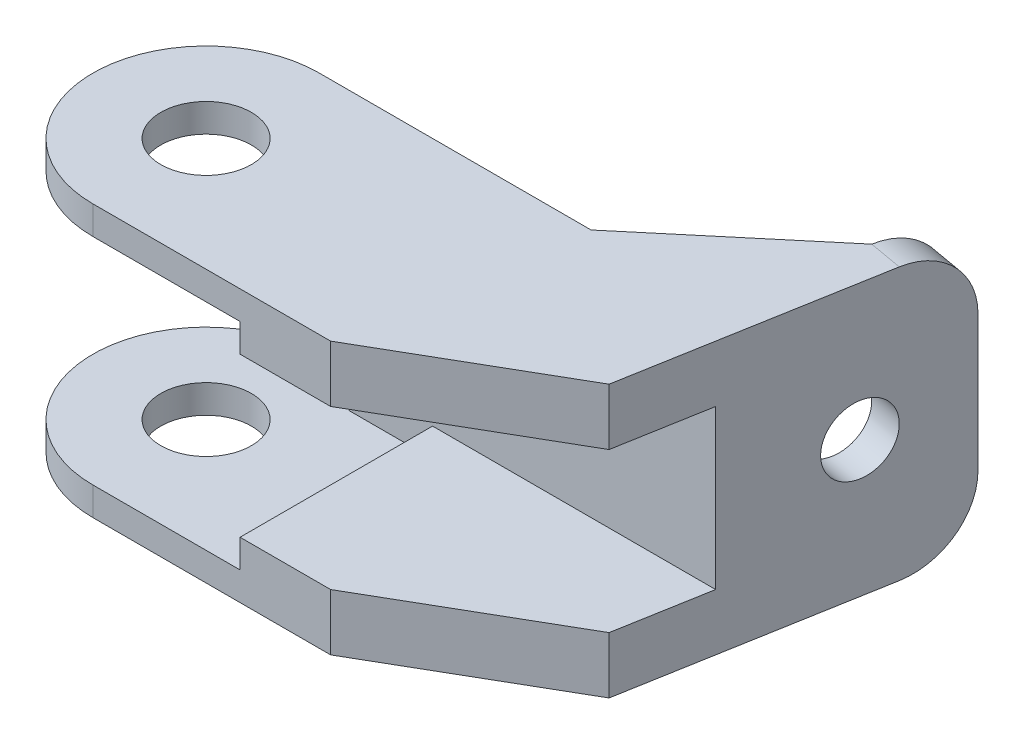
ISO-10303-21;
HEADER;
FILE_DESCRIPTION(('STEP AP214'),'2;1');
FILE_NAME('part.step','',(''),(''),'','','');
FILE_SCHEMA(('AUTOMOTIVE_DESIGN { 1 0 10303 214 1 1 1 1 }'));
ENDSEC;
DATA;
#1=APPLICATION_CONTEXT('core data for automotive mechanical design processes');
#2=APPLICATION_PROTOCOL_DEFINITION('international standard','automotive_design',2000,#1);
#3=PRODUCT_CONTEXT('',#1,'mechanical');
#4=PRODUCT('Part','Part','',(#3));
#5=PRODUCT_RELATED_PRODUCT_CATEGORY('part','',(#4));
#6=PRODUCT_DEFINITION_FORMATION('','',#4);
#7=PRODUCT_DEFINITION_CONTEXT('part definition',#1,'design');
#8=PRODUCT_DEFINITION('design','',#6,#7);
#9=PRODUCT_DEFINITION_SHAPE('','',#8);
#10=(LENGTH_UNIT() NAMED_UNIT(*) SI_UNIT(.MILLI.,.METRE.));
#11=(NAMED_UNIT(*) PLANE_ANGLE_UNIT() SI_UNIT($,.RADIAN.));
#12=(NAMED_UNIT(*) SI_UNIT($,.STERADIAN.) SOLID_ANGLE_UNIT());
#13=UNCERTAINTY_MEASURE_WITH_UNIT(LENGTH_MEASURE(1.E-05),#10,'distance_accuracy_value','');
#14=(GEOMETRIC_REPRESENTATION_CONTEXT(3) GLOBAL_UNCERTAINTY_ASSIGNED_CONTEXT((#13)) GLOBAL_UNIT_ASSIGNED_CONTEXT((#10,
#11,#12)) REPRESENTATION_CONTEXT('',''));
#15=CARTESIAN_POINT('',(0.,0.,0.));
#16=DIRECTION('',(0.,0.,1.));
#17=DIRECTION('',(1.,0.,0.));
#18=AXIS2_PLACEMENT_3D('',#15,#16,#17);
#19=CARTESIAN_POINT('',(-99.25,8.25,30.));
#20=DIRECTION('',(0.,-1.,0.));
#21=DIRECTION('',(0.,0.,-1.));
#22=AXIS2_PLACEMENT_3D('',#19,#20,#21);
#23=PLANE('',#22);
#24=CARTESIAN_POINT('',(-100.,8.25,30.));
#25=DIRECTION('',(0.,1.,0.));
#26=DIRECTION('',(0.,0.,1.));
#27=AXIS2_PLACEMENT_3D('',#24,#25,#26);
#28=CIRCLE('',#27,2.);
#29=CARTESIAN_POINT('',(-100.,8.25,32.));
#30=VERTEX_POINT('',#29);
#31=EDGE_CURVE('E289',#30,#30,#28,.T.);
#32=ORIENTED_EDGE('',*,*,#31,.T.);
#33=EDGE_LOOP('',(#32));
#34=FACE_BOUND('',#33,.T.);
#35=DIRECTION('',(0.,0.,1.));
#36=VECTOR('',#35,1.);
#37=CARTESIAN_POINT('',(-97.2,8.25,22.469683814224));
#38=LINE('',#37,#36);
#39=CARTESIAN_POINT('',(-97.2,8.25,25.));
#40=VERTEX_POINT('',#39);
#41=CARTESIAN_POINT('',(-97.2,8.25,26.5));
#42=VERTEX_POINT('',#41);
#43=EDGE_CURVE('E226',#40,#42,#38,.T.);
#44=ORIENTED_EDGE('',*,*,#43,.T.);
#45=DIRECTION('',(1.,0.,0.));
#46=VECTOR('',#45,1.);
#47=CARTESIAN_POINT('',(-99.25,8.25,26.5));
#48=LINE('',#47,#46);
#49=CARTESIAN_POINT('',(-93.5,8.25,26.5));
#50=VERTEX_POINT('',#49);
#51=EDGE_CURVE('E299',#42,#50,#48,.T.);
#52=ORIENTED_EDGE('',*,*,#51,.T.);
#53=DIRECTION('',(0.,0.,-1.));
#54=VECTOR('',#53,1.);
#55=CARTESIAN_POINT('',(-93.5,8.25,30.));
#56=LINE('',#55,#54);
#57=CARTESIAN_POINT('',(-93.5,8.25,35.));
#58=VERTEX_POINT('',#57);
#59=EDGE_CURVE('E302',#50,#58,#56,.F.);
#60=ORIENTED_EDGE('',*,*,#59,.T.);
#61=DIRECTION('',(1.,0.,0.));
#62=VECTOR('',#61,1.);
#63=CARTESIAN_POINT('',(-94.75,8.25,35.));
#64=LINE('',#63,#62);
#65=CARTESIAN_POINT('',(-100.,8.25,35.));
#66=VERTEX_POINT('',#65);
#67=EDGE_CURVE('E253',#66,#58,#64,.T.);
#68=ORIENTED_EDGE('',*,*,#67,.F.);
#69=CARTESIAN_POINT('',(-100.,8.25,30.));
#70=DIRECTION('',(0.,1.,0.));
#71=DIRECTION('',(0.,0.,1.));
#72=AXIS2_PLACEMENT_3D('',#69,#70,#71);
#73=CIRCLE('',#72,5.);
#74=CARTESIAN_POINT('',(-100.,8.25,25.));
#75=VERTEX_POINT('',#74);
#76=EDGE_CURVE('E249',#75,#66,#73,.T.);
#77=ORIENTED_EDGE('',*,*,#76,.F.);
#78=DIRECTION('',(-1.,0.,0.));
#79=VECTOR('',#78,1.);
#80=CARTESIAN_POINT('',(-90.5,8.25,25.));
#81=LINE('',#80,#79);
#82=EDGE_CURVE('E245',#40,#75,#81,.T.);
#83=ORIENTED_EDGE('',*,*,#82,.F.);
#84=EDGE_LOOP('',(#44,#52,#60,#68,#77,#83));
#85=FACE_BOUND('',#84,.T.);
#86=ADVANCED_FACE('F34',(#34,#85),#23,.T.);
#87=CARTESIAN_POINT('',(-93.5,3.5,30.));
#88=DIRECTION('',(-1.,0.,0.));
#89=DIRECTION('',(0.,0.,1.));
#90=AXIS2_PLACEMENT_3D('',#87,#88,#89);
#91=PLANE('',#90);
#92=DIRECTION('',(0.,1.,0.));
#93=VECTOR('',#92,1.);
#94=CARTESIAN_POINT('',(-93.5,-2.5,35.));
#95=LINE('',#94,#93);
#96=CARTESIAN_POINT('',(-93.5,0.,35.));
#97=VERTEX_POINT('',#96);
#98=CARTESIAN_POINT('',(-93.5,-1.25,35.));
#99=VERTEX_POINT('',#98);
#100=EDGE_CURVE('E229',#97,#99,#95,.F.);
#101=ORIENTED_EDGE('',*,*,#100,.F.);
#102=DIRECTION('',(0.,0.,-1.));
#103=VECTOR('',#102,1.);
#104=CARTESIAN_POINT('',(-93.5,0.,30.));
#105=LINE('',#104,#103);
#106=CARTESIAN_POINT('',(-93.5,0.,26.5));
#107=VERTEX_POINT('',#106);
#108=EDGE_CURVE('E282',#97,#107,#105,.T.);
#109=ORIENTED_EDGE('',*,*,#108,.T.);
#110=DIRECTION('',(0.,1.,0.));
#111=VECTOR('',#110,1.);
#112=CARTESIAN_POINT('',(-93.5,-1.25,26.5));
#113=LINE('',#112,#111);
#114=CARTESIAN_POINT('',(-93.5,-1.25,26.5));
#115=VERTEX_POINT('',#114);
#116=EDGE_CURVE('E308',#115,#107,#113,.T.);
#117=ORIENTED_EDGE('',*,*,#116,.F.);
#118=DIRECTION('',(0.,0.,-1.));
#119=VECTOR('',#118,1.);
#120=CARTESIAN_POINT('',(-93.5,-1.25,30.));
#121=LINE('',#120,#119);
#122=EDGE_CURVE('E324',#115,#99,#121,.F.);
#123=ORIENTED_EDGE('',*,*,#122,.T.);
#124=EDGE_LOOP('',(#101,#109,#117,#123));
#125=FACE_BOUND('',#124,.T.);
#126=ADVANCED_FACE('F496',(#125),#91,.T.);
#127=CARTESIAN_POINT('',(-94.75,-2.5,35.));
#128=DIRECTION('',(0.,0.,1.));
#129=DIRECTION('',(1.,0.,0.));
#130=AXIS2_PLACEMENT_3D('',#127,#128,#129);
#131=PLANE('',#130);
#132=DIRECTION('',(1.,0.,0.));
#133=VECTOR('',#132,1.);
#134=CARTESIAN_POINT('',(-92.8126047629245,-2.5,35.));
#135=LINE('',#134,#133);
#136=CARTESIAN_POINT('',(-89.5,-2.5,35.));
#137=VERTEX_POINT('',#136);
#138=CARTESIAN_POINT('',(-100.,-2.5,35.));
#139=VERTEX_POINT('',#138);
#140=EDGE_CURVE('E268',#137,#139,#135,.F.);
#141=ORIENTED_EDGE('',*,*,#140,.F.);
#142=DIRECTION('',(0.,1.,0.));
#143=VECTOR('',#142,1.);
#144=CARTESIAN_POINT('',(-89.5,-2.5,35.));
#145=LINE('',#144,#143);
#146=CARTESIAN_POINT('',(-89.5,0.,35.));
#147=VERTEX_POINT('',#146);
#148=EDGE_CURVE('E296',#147,#137,#145,.F.);
#149=ORIENTED_EDGE('',*,*,#148,.F.);
#150=DIRECTION('',(1.,0.,0.));
#151=VECTOR('',#150,1.);
#152=CARTESIAN_POINT('',(-91.,0.,35.));
#153=LINE('',#152,#151);
#154=EDGE_CURVE('E314',#147,#97,#153,.F.);
#155=ORIENTED_EDGE('',*,*,#154,.T.);
#156=ORIENTED_EDGE('',*,*,#100,.T.);
#157=DIRECTION('',(1.,0.,0.));
#158=VECTOR('',#157,1.);
#159=CARTESIAN_POINT('',(-99.25,-1.25,35.));
#160=LINE('',#159,#158);
#161=CARTESIAN_POINT('',(-100.,-1.25,35.));
#162=VERTEX_POINT('',#161);
#163=EDGE_CURVE('E336',#99,#162,#160,.F.);
#164=ORIENTED_EDGE('',*,*,#163,.T.);
#165=DIRECTION('',(0.,1.,0.));
#166=VECTOR('',#165,1.);
#167=CARTESIAN_POINT('',(-100.,-2.5,35.));
#168=LINE('',#167,#166);
#169=EDGE_CURVE('E309',#139,#162,#168,.T.);
#170=ORIENTED_EDGE('',*,*,#169,.F.);
#171=EDGE_LOOP('',(#141,#149,#155,#156,#164,#170));
#172=FACE_BOUND('',#171,.T.);
#173=ADVANCED_FACE('F504',(#172),#131,.T.);
#174=CARTESIAN_POINT('',(-100.,-2.5,30.));
#175=DIRECTION('',(0.,1.,0.));
#176=DIRECTION('',(0.,0.,1.));
#177=AXIS2_PLACEMENT_3D('',#174,#175,#176);
#178=CYLINDRICAL_SURFACE('',#177,5.);
#179=CARTESIAN_POINT('',(-100.,-2.5,30.));
#180=DIRECTION('',(0.,1.,0.));
#181=DIRECTION('',(0.,0.,1.));
#182=AXIS2_PLACEMENT_3D('',#179,#180,#181);
#183=CIRCLE('',#182,5.);
#184=CARTESIAN_POINT('',(-100.,-2.5,25.));
#185=VERTEX_POINT('',#184);
#186=EDGE_CURVE('E269',#139,#185,#183,.F.);
#187=ORIENTED_EDGE('',*,*,#186,.F.);
#188=ORIENTED_EDGE('',*,*,#169,.T.);
#189=CARTESIAN_POINT('',(-100.,-1.25,30.));
#190=DIRECTION('',(0.,1.,0.));
#191=DIRECTION('',(0.,0.,1.));
#192=AXIS2_PLACEMENT_3D('',#189,#190,#191);
#193=CIRCLE('',#192,5.);
#194=CARTESIAN_POINT('',(-100.,-1.25,25.));
#195=VERTEX_POINT('',#194);
#196=EDGE_CURVE('E363',#162,#195,#193,.F.);
#197=ORIENTED_EDGE('',*,*,#196,.T.);
#198=DIRECTION('',(0.,1.,0.));
#199=VECTOR('',#198,1.);
#200=CARTESIAN_POINT('',(-100.,-2.5,25.));
#201=LINE('',#200,#199);
#202=EDGE_CURVE('E328',#195,#185,#201,.F.);
#203=ORIENTED_EDGE('',*,*,#202,.T.);
#204=EDGE_LOOP('',(#187,#188,#197,#203));
#205=FACE_BOUND('',#204,.T.);
#206=ADVANCED_FACE('F565',(#205),#178,.T.);
#207=CARTESIAN_POINT('',(-100.,3.5,30.));
#208=DIRECTION('',(0.,1.,0.));
#209=DIRECTION('',(0.,0.,1.));
#210=AXIS2_PLACEMENT_3D('',#207,#208,#209);
#211=CYLINDRICAL_SURFACE('',#210,2.);
#212=CARTESIAN_POINT('',(-100.,-1.25,30.));
#213=DIRECTION('',(0.,1.,0.));
#214=DIRECTION('',(0.,0.,1.));
#215=AXIS2_PLACEMENT_3D('',#212,#213,#214);
#216=CIRCLE('',#215,2.);
#217=CARTESIAN_POINT('',(-100.,-1.25,32.));
#218=VERTEX_POINT('',#217);
#219=EDGE_CURVE('E318',#218,#218,#216,.T.);
#220=ORIENTED_EDGE('',*,*,#219,.T.);
#221=EDGE_LOOP('',(#220));
#222=FACE_BOUND('',#221,.T.);
#223=CARTESIAN_POINT('',(-100.,-2.5,30.));
#224=DIRECTION('',(0.,1.,0.));
#225=DIRECTION('',(0.,0.,1.));
#226=AXIS2_PLACEMENT_3D('',#223,#224,#225);
#227=CIRCLE('',#226,2.);
#228=CARTESIAN_POINT('',(-100.,-2.5,32.));
#229=VERTEX_POINT('',#228);
#230=EDGE_CURVE('E367',#229,#229,#227,.T.);
#231=ORIENTED_EDGE('',*,*,#230,.F.);
#232=EDGE_LOOP('',(#231));
#233=FACE_BOUND('',#232,.T.);
#234=ADVANCED_FACE('F561',(#222,#233),#211,.F.);
#235=CARTESIAN_POINT('',(-93.5,3.5,30.));
#236=DIRECTION('',(-1.,0.,0.));
#237=DIRECTION('',(0.,0.,1.));
#238=AXIS2_PLACEMENT_3D('',#235,#236,#237);
#239=PLANE('',#238);
#240=DIRECTION('',(0.,1.,0.));
#241=VECTOR('',#240,1.);
#242=CARTESIAN_POINT('',(-93.5,3.5,35.));
#243=LINE('',#242,#241);
#244=CARTESIAN_POINT('',(-93.5,7.,35.));
#245=VERTEX_POINT('',#244);
#246=EDGE_CURVE('E306',#245,#58,#243,.T.);
#247=ORIENTED_EDGE('',*,*,#246,.T.);
#248=ORIENTED_EDGE('',*,*,#59,.F.);
#249=DIRECTION('',(0.,1.,0.));
#250=VECTOR('',#249,1.);
#251=CARTESIAN_POINT('',(-93.5,-1.25,26.5));
#252=LINE('',#251,#250);
#253=CARTESIAN_POINT('',(-93.5,7.,26.5));
#254=VERTEX_POINT('',#253);
#255=EDGE_CURVE('E312',#254,#50,#252,.T.);
#256=ORIENTED_EDGE('',*,*,#255,.F.);
#257=DIRECTION('',(0.,0.,-1.));
#258=VECTOR('',#257,1.);
#259=CARTESIAN_POINT('',(-93.5,7.,30.));
#260=LINE('',#259,#258);
#261=EDGE_CURVE('E295',#245,#254,#260,.T.);
#262=ORIENTED_EDGE('',*,*,#261,.F.);
#263=EDGE_LOOP('',(#247,#248,#256,#262));
#264=FACE_BOUND('',#263,.T.);
#265=ADVANCED_FACE('F557',(#264),#239,.T.);
#266=CARTESIAN_POINT('',(-89.1,-1.25,26.5));
#267=DIRECTION('',(0.,0.,1.));
#268=DIRECTION('',(1.,0.,0.));
#269=AXIS2_PLACEMENT_3D('',#266,#267,#268);
#270=PLANE('',#269);
#271=ORIENTED_EDGE('',*,*,#51,.F.);
#272=DIRECTION('',(0.,1.,0.));
#273=VECTOR('',#272,1.);
#274=CARTESIAN_POINT('',(-97.2,-1.25,26.5));
#275=LINE('',#274,#273);
#276=CARTESIAN_POINT('',(-97.2,-1.25,26.5));
#277=VERTEX_POINT('',#276);
#278=EDGE_CURVE('E303',#277,#42,#275,.T.);
#279=ORIENTED_EDGE('',*,*,#278,.F.);
#280=DIRECTION('',(1.,0.,0.));
#281=VECTOR('',#280,1.);
#282=CARTESIAN_POINT('',(-99.25,-1.25,26.5));
#283=LINE('',#282,#281);
#284=EDGE_CURVE('E321',#277,#115,#283,.T.);
#285=ORIENTED_EDGE('',*,*,#284,.T.);
#286=ORIENTED_EDGE('',*,*,#116,.T.);
#287=DIRECTION('',(1.,0.,0.));
#288=VECTOR('',#287,1.);
#289=CARTESIAN_POINT('',(-91.,0.,26.5));
#290=LINE('',#289,#288);
#291=CARTESIAN_POINT('',(-81.,0.,26.5));
#292=VERTEX_POINT('',#291);
#293=EDGE_CURVE('E279',#107,#292,#290,.T.);
#294=ORIENTED_EDGE('',*,*,#293,.T.);
#295=DIRECTION('',(0.,1.,0.));
#296=VECTOR('',#295,1.);
#297=CARTESIAN_POINT('',(-81.,-2.5,26.5));
#298=LINE('',#297,#296);
#299=CARTESIAN_POINT('',(-81.,7.,26.4999999999999));
#300=VERTEX_POINT('',#299);
#301=EDGE_CURVE('E285',#300,#292,#298,.F.);
#302=ORIENTED_EDGE('',*,*,#301,.F.);
#303=DIRECTION('',(1.,0.,0.));
#304=VECTOR('',#303,1.);
#305=CARTESIAN_POINT('',(-91.,7.,26.5));
#306=LINE('',#305,#304);
#307=EDGE_CURVE('E292',#254,#300,#306,.T.);
#308=ORIENTED_EDGE('',*,*,#307,.F.);
#309=ORIENTED_EDGE('',*,*,#255,.T.);
#310=EDGE_LOOP('',(#271,#279,#285,#286,#294,#302,#308,#309));
#311=FACE_BOUND('',#310,.T.);
#312=ADVANCED_FACE('F553',(#311),#270,.T.);
#313=CARTESIAN_POINT('',(-91.,0.,30.));
#314=DIRECTION('',(0.,-1.,0.));
#315=DIRECTION('',(0.,0.,-1.));
#316=AXIS2_PLACEMENT_3D('',#313,#314,#315);
#317=PLANE('',#316);
#318=DIRECTION('',(0.86602540378496,0.,-0.499999999999097));
#319=VECTOR('',#318,1.);
#320=CARTESIAN_POINT('',(-85.25,0.,32.54626135595));
#321=LINE('',#320,#319);
#322=CARTESIAN_POINT('',(-81.7052553958245,0.,30.4997021045267));
#323=VERTEX_POINT('',#322);
#324=EDGE_CURVE('E270',#323,#147,#321,.F.);
#325=ORIENTED_EDGE('',*,*,#324,.F.);
#326=DIRECTION('',(0.173648177666935,0.,-0.984807753012207));
#327=VECTOR('',#326,1.);
#328=CARTESIAN_POINT('',(-81.9000721468904,0.,31.6045628030037));
#329=LINE('',#328,#327);
#330=EDGE_CURVE('E462',#323,#292,#329,.T.);
#331=ORIENTED_EDGE('',*,*,#330,.T.);
#332=ORIENTED_EDGE('',*,*,#293,.F.);
#333=ORIENTED_EDGE('',*,*,#108,.F.);
#334=ORIENTED_EDGE('',*,*,#154,.F.);
#335=EDGE_LOOP('',(#325,#331,#332,#333,#334));
#336=FACE_BOUND('',#335,.T.);
#337=ADVANCED_FACE('F549',(#336),#317,.F.);
#338=CARTESIAN_POINT('',(-85.25,-2.5,32.54626135595));
#339=DIRECTION('',(0.499999999999097,0.,0.86602540378496));
#340=DIRECTION('',(0.86602540378496,0.,-0.499999999999097));
#341=AXIS2_PLACEMENT_3D('',#338,#339,#340);
#342=PLANE('',#341);
#343=DIRECTION('',(0.,1.,0.));
#344=VECTOR('',#343,1.);
#345=CARTESIAN_POINT('',(-81.7052553958245,-2.50010307764071,30.4997021045267));
#346=LINE('',#345,#344);
#347=CARTESIAN_POINT('',(-81.7052553958245,-2.5,30.4997021045267));
#348=VERTEX_POINT('',#347);
#349=EDGE_CURVE('E464',#348,#323,#346,.T.);
#350=ORIENTED_EDGE('',*,*,#349,.T.);
#351=ORIENTED_EDGE('',*,*,#324,.T.);
#352=ORIENTED_EDGE('',*,*,#148,.T.);
#353=DIRECTION('',(-0.86602540378496,0.,0.499999999999097));
#354=VECTOR('',#353,1.);
#355=CARTESIAN_POINT('',(-81.,-2.5,30.0925227119));
#356=LINE('',#355,#354);
#357=EDGE_CURVE('E265',#348,#137,#356,.T.);
#358=ORIENTED_EDGE('',*,*,#357,.F.);
#359=EDGE_LOOP('',(#350,#351,#352,#358));
#360=FACE_BOUND('',#359,.T.);
#361=ADVANCED_FACE('F546',(#360),#342,.T.);
#362=CARTESIAN_POINT('',(-91.,7.,30.));
#363=DIRECTION('',(0.,-1.,0.));
#364=DIRECTION('',(0.,0.,-1.));
#365=AXIS2_PLACEMENT_3D('',#362,#363,#364);
#366=PLANE('',#365);
#367=DIRECTION('',(0.173648177666935,0.,-0.984807753012207));
#368=VECTOR('',#367,1.);
#369=CARTESIAN_POINT('',(-81.9000721468904,7.,31.6045628030037));
#370=LINE('',#369,#368);
#371=CARTESIAN_POINT('',(-81.7052553958245,7.,30.4997021045267));
#372=VERTEX_POINT('',#371);
#373=EDGE_CURVE('E460',#372,#300,#370,.T.);
#374=ORIENTED_EDGE('',*,*,#373,.F.);
#375=DIRECTION('',(0.86602540378496,0.,-0.499999999999097));
#376=VECTOR('',#375,1.);
#377=CARTESIAN_POINT('',(-85.25,7.,32.54626135595));
#378=LINE('',#377,#376);
#379=CARTESIAN_POINT('',(-89.5,7.,35.));
#380=VERTEX_POINT('',#379);
#381=EDGE_CURVE('E288',#380,#372,#378,.T.);
#382=ORIENTED_EDGE('',*,*,#381,.F.);
#383=DIRECTION('',(1.,0.,0.));
#384=VECTOR('',#383,1.);
#385=CARTESIAN_POINT('',(-94.75,7.,35.));
#386=LINE('',#385,#384);
#387=EDGE_CURVE('E254',#245,#380,#386,.T.);
#388=ORIENTED_EDGE('',*,*,#387,.F.);
#389=ORIENTED_EDGE('',*,*,#261,.T.);
#390=ORIENTED_EDGE('',*,*,#307,.T.);
#391=EDGE_LOOP('',(#374,#382,#388,#389,#390));
#392=FACE_BOUND('',#391,.T.);
#393=ADVANCED_FACE('F459',(#392),#366,.T.);
#394=CARTESIAN_POINT('',(-92.8126047629245,-2.5,29.500888957171));
#395=DIRECTION('',(0.,-1.,0.));
#396=DIRECTION('',(0.,0.,-1.));
#397=AXIS2_PLACEMENT_3D('',#394,#395,#396);
#398=PLANE('',#397);
#399=DIRECTION('',(0.766044443118981,0.,-0.642787609686536));
#400=VECTOR('',#399,1.);
#401=CARTESIAN_POINT('',(-88.,-2.5,25.));
#402=LINE('',#401,#400);
#403=CARTESIAN_POINT('',(-88.,-2.5,25.));
#404=VERTEX_POINT('',#403);
#405=CARTESIAN_POINT('',(-81.2616743858498,-2.5,19.3458734624141));
#406=VERTEX_POINT('',#405);
#407=EDGE_CURVE('E419',#404,#406,#402,.T.);
#408=ORIENTED_EDGE('',*,*,#407,.T.);
#409=DIRECTION('',(0.984807753012207,0.,0.173648177666938));
#410=VECTOR('',#409,1.);
#411=CARTESIAN_POINT('',(-90.7276916661659,-2.5,17.6767592160418));
#412=LINE('',#411,#410);
#413=CARTESIAN_POINT('',(-79.7844627563315,-2.5,19.6063457289146));
#414=VERTEX_POINT('',#413);
#415=EDGE_CURVE('E232',#406,#414,#412,.T.);
#416=ORIENTED_EDGE('',*,*,#415,.T.);
#417=DIRECTION('',(-0.173648177666935,0.,0.984807753012207));
#418=VECTOR('',#417,1.);
#419=CARTESIAN_POINT('',(-81.,-2.5,26.5));
#420=LINE('',#419,#418);
#421=EDGE_CURVE('E217',#414,#348,#420,.T.);
#422=ORIENTED_EDGE('',*,*,#421,.T.);
#423=ORIENTED_EDGE('',*,*,#357,.T.);
#424=ORIENTED_EDGE('',*,*,#140,.T.);
#425=ORIENTED_EDGE('',*,*,#186,.T.);
#426=DIRECTION('',(-1.,0.,0.));
#427=VECTOR('',#426,1.);
#428=CARTESIAN_POINT('',(-90.5,-2.5,25.));
#429=LINE('',#428,#427);
#430=EDGE_CURVE('E248',#404,#185,#429,.T.);
#431=ORIENTED_EDGE('',*,*,#430,.F.);
#432=EDGE_LOOP('',(#408,#416,#422,#423,#424,#425,#431));
#433=FACE_BOUND('',#432,.T.);
#434=ORIENTED_EDGE('',*,*,#230,.T.);
#435=EDGE_LOOP('',(#434));
#436=FACE_BOUND('',#435,.T.);
#437=ADVANCED_FACE('F420',(#433,#436),#398,.T.);
#438=CARTESIAN_POINT('',(-99.25,-1.25,30.));
#439=DIRECTION('',(0.,-1.,0.));
#440=DIRECTION('',(0.,0.,-1.));
#441=AXIS2_PLACEMENT_3D('',#438,#439,#440);
#442=PLANE('',#441);
#443=ORIENTED_EDGE('',*,*,#219,.F.);
#444=EDGE_LOOP('',(#443));
#445=FACE_BOUND('',#444,.T.);
#446=ORIENTED_EDGE('',*,*,#284,.F.);
#447=DIRECTION('',(0.,0.,1.));
#448=VECTOR('',#447,1.);
#449=CARTESIAN_POINT('',(-97.2,-1.25,22.469683814224));
#450=LINE('',#449,#448);
#451=CARTESIAN_POINT('',(-97.2,-1.25,25.));
#452=VERTEX_POINT('',#451);
#453=EDGE_CURVE('E223',#452,#277,#450,.T.);
#454=ORIENTED_EDGE('',*,*,#453,.F.);
#455=DIRECTION('',(-1.,0.,0.));
#456=VECTOR('',#455,1.);
#457=CARTESIAN_POINT('',(-90.5,-1.25,25.));
#458=LINE('',#457,#456);
#459=EDGE_CURVE('E397',#195,#452,#458,.F.);
#460=ORIENTED_EDGE('',*,*,#459,.F.);
#461=ORIENTED_EDGE('',*,*,#196,.F.);
#462=ORIENTED_EDGE('',*,*,#163,.F.);
#463=ORIENTED_EDGE('',*,*,#122,.F.);
#464=EDGE_LOOP('',(#446,#454,#460,#461,#462,#463));
#465=FACE_BOUND('',#464,.T.);
#466=ADVANCED_FACE('F531',(#445,#465),#442,.F.);
#467=CARTESIAN_POINT('',(-97.2,-1.25,25.75));
#468=DIRECTION('',(-1.,0.,0.));
#469=DIRECTION('',(0.,0.,1.));
#470=AXIS2_PLACEMENT_3D('',#467,#468,#469);
#471=PLANE('',#470);
#472=DIRECTION('',(0.,1.,0.));
#473=VECTOR('',#472,1.);
#474=CARTESIAN_POINT('',(-97.2,-2.5,25.));
#475=LINE('',#474,#473);
#476=EDGE_CURVE('E845',#452,#40,#475,.T.);
#477=ORIENTED_EDGE('',*,*,#476,.F.);
#478=ORIENTED_EDGE('',*,*,#453,.T.);
#479=ORIENTED_EDGE('',*,*,#278,.T.);
#480=ORIENTED_EDGE('',*,*,#43,.F.);
#481=EDGE_LOOP('',(#477,#478,#479,#480));
#482=FACE_BOUND('',#481,.T.);
#483=ADVANCED_FACE('F526',(#482),#471,.T.);
#484=CARTESIAN_POINT('',(-100.,3.5,30.));
#485=DIRECTION('',(0.,1.,0.));
#486=DIRECTION('',(0.,0.,1.));
#487=AXIS2_PLACEMENT_3D('',#484,#485,#486);
#488=CYLINDRICAL_SURFACE('',#487,2.);
#489=ORIENTED_EDGE('',*,*,#31,.F.);
#490=EDGE_LOOP('',(#489));
#491=FACE_BOUND('',#490,.T.);
#492=CARTESIAN_POINT('',(-100.,9.5,30.));
#493=DIRECTION('',(0.,1.,0.));
#494=DIRECTION('',(0.,0.,1.));
#495=AXIS2_PLACEMENT_3D('',#492,#493,#494);
#496=CIRCLE('',#495,2.);
#497=CARTESIAN_POINT('',(-100.,9.5,32.));
#498=VERTEX_POINT('',#497);
#499=EDGE_CURVE('E244',#498,#498,#496,.T.);
#500=ORIENTED_EDGE('',*,*,#499,.T.);
#501=EDGE_LOOP('',(#500));
#502=FACE_BOUND('',#501,.T.);
#503=ADVANCED_FACE('F524',(#491,#502),#488,.F.);
#504=CARTESIAN_POINT('',(-85.25,-2.5,32.54626135595));
#505=DIRECTION('',(0.499999999999097,0.,0.86602540378496));
#506=DIRECTION('',(0.86602540378496,0.,-0.499999999999097));
#507=AXIS2_PLACEMENT_3D('',#504,#505,#506);
#508=PLANE('',#507);
#509=CARTESIAN_POINT('',(-81.7052553958245,9.5,30.4997021045267));
#510=VERTEX_POINT('',#509);
#511=EDGE_CURVE('E429',#372,#510,#346,.T.);
#512=ORIENTED_EDGE('',*,*,#511,.T.);
#513=DIRECTION('',(-0.86602540378496,0.,0.499999999999097));
#514=VECTOR('',#513,1.);
#515=CARTESIAN_POINT('',(-81.,9.5,30.0925227119));
#516=LINE('',#515,#514);
#517=CARTESIAN_POINT('',(-89.5,9.5,35.));
#518=VERTEX_POINT('',#517);
#519=EDGE_CURVE('E239',#510,#518,#516,.T.);
#520=ORIENTED_EDGE('',*,*,#519,.T.);
#521=DIRECTION('',(0.,1.,0.));
#522=VECTOR('',#521,1.);
#523=CARTESIAN_POINT('',(-89.5,-2.5,35.));
#524=LINE('',#523,#522);
#525=EDGE_CURVE('E250',#380,#518,#524,.T.);
#526=ORIENTED_EDGE('',*,*,#525,.F.);
#527=ORIENTED_EDGE('',*,*,#381,.T.);
#528=EDGE_LOOP('',(#512,#520,#526,#527));
#529=FACE_BOUND('',#528,.T.);
#530=ADVANCED_FACE('F453',(#529),#508,.T.);
#531=CARTESIAN_POINT('',(-94.75,-2.5,35.));
#532=DIRECTION('',(0.,0.,1.));
#533=DIRECTION('',(1.,0.,0.));
#534=AXIS2_PLACEMENT_3D('',#531,#532,#533);
#535=PLANE('',#534);
#536=ORIENTED_EDGE('',*,*,#67,.T.);
#537=ORIENTED_EDGE('',*,*,#246,.F.);
#538=ORIENTED_EDGE('',*,*,#387,.T.);
#539=ORIENTED_EDGE('',*,*,#525,.T.);
#540=DIRECTION('',(1.,0.,0.));
#541=VECTOR('',#540,1.);
#542=CARTESIAN_POINT('',(-92.8126047629245,9.5,35.));
#543=LINE('',#542,#541);
#544=CARTESIAN_POINT('',(-100.,9.5,35.));
#545=VERTEX_POINT('',#544);
#546=EDGE_CURVE('E236',#518,#545,#543,.F.);
#547=ORIENTED_EDGE('',*,*,#546,.T.);
#548=DIRECTION('',(0.,1.,0.));
#549=VECTOR('',#548,1.);
#550=CARTESIAN_POINT('',(-100.,-2.5,35.));
#551=LINE('',#550,#549);
#552=EDGE_CURVE('E246',#66,#545,#551,.T.);
#553=ORIENTED_EDGE('',*,*,#552,.F.);
#554=EDGE_LOOP('',(#536,#537,#538,#539,#547,#553));
#555=FACE_BOUND('',#554,.T.);
#556=ADVANCED_FACE('F455',(#555),#535,.T.);
#557=CARTESIAN_POINT('',(-100.,-2.5,30.));
#558=DIRECTION('',(0.,1.,0.));
#559=DIRECTION('',(0.,0.,1.));
#560=AXIS2_PLACEMENT_3D('',#557,#558,#559);
#561=CYLINDRICAL_SURFACE('',#560,5.);
#562=CARTESIAN_POINT('',(-100.,9.5,30.));
#563=DIRECTION('',(0.,1.,0.));
#564=DIRECTION('',(0.,0.,1.));
#565=AXIS2_PLACEMENT_3D('',#562,#563,#564);
#566=CIRCLE('',#565,5.);
#567=CARTESIAN_POINT('',(-100.,9.5,25.));
#568=VERTEX_POINT('',#567);
#569=EDGE_CURVE('E233',#545,#568,#566,.F.);
#570=ORIENTED_EDGE('',*,*,#569,.T.);
#571=DIRECTION('',(0.,1.,0.));
#572=VECTOR('',#571,1.);
#573=CARTESIAN_POINT('',(-100.,-2.5,25.));
#574=LINE('',#573,#572);
#575=EDGE_CURVE('E242',#75,#568,#574,.T.);
#576=ORIENTED_EDGE('',*,*,#575,.F.);
#577=ORIENTED_EDGE('',*,*,#76,.T.);
#578=ORIENTED_EDGE('',*,*,#552,.T.);
#579=EDGE_LOOP('',(#570,#576,#577,#578));
#580=FACE_BOUND('',#579,.T.);
#581=ADVANCED_FACE('F515',(#580),#561,.T.);
#582=CARTESIAN_POINT('',(-90.5,-2.5,25.));
#583=DIRECTION('',(0.,0.,-1.));
#584=DIRECTION('',(-1.,0.,0.));
#585=AXIS2_PLACEMENT_3D('',#582,#583,#584);
#586=PLANE('',#585);
#587=DIRECTION('',(0.,1.,0.));
#588=VECTOR('',#587,1.);
#589=CARTESIAN_POINT('',(-88.,8.,25.));
#590=LINE('',#589,#588);
#591=CARTESIAN_POINT('',(-88.,8.,25.));
#592=VERTEX_POINT('',#591);
#593=CARTESIAN_POINT('',(-88.,9.5,25.));
#594=VERTEX_POINT('',#593);
#595=EDGE_CURVE('E205',#592,#594,#590,.T.);
#596=ORIENTED_EDGE('',*,*,#595,.F.);
#597=DIRECTION('',(1.,0.,0.));
#598=VECTOR('',#597,1.);
#599=CARTESIAN_POINT('',(-82.2586494467659,8.,25.));
#600=LINE('',#599,#598);
#601=CARTESIAN_POINT('',(-82.2586494467659,8.,25.));
#602=VERTEX_POINT('',#601);
#603=EDGE_CURVE('E193',#592,#602,#600,.T.);
#604=ORIENTED_EDGE('',*,*,#603,.T.);
#605=DIRECTION('',(0.,-1.,0.));
#606=VECTOR('',#605,1.);
#607=CARTESIAN_POINT('',(-82.2586494467659,30.0888357493956,25.));
#608=LINE('',#607,#606);
#609=CARTESIAN_POINT('',(-82.2586494467659,-1.,25.));
#610=VERTEX_POINT('',#609);
#611=EDGE_CURVE('E202',#602,#610,#608,.T.);
#612=ORIENTED_EDGE('',*,*,#611,.T.);
#613=DIRECTION('',(-1.,0.,0.));
#614=VECTOR('',#613,1.);
#615=CARTESIAN_POINT('',(-82.2586494467659,-1.,25.));
#616=LINE('',#615,#614);
#617=CARTESIAN_POINT('',(-88.,-1.,25.));
#618=VERTEX_POINT('',#617);
#619=EDGE_CURVE('E474',#610,#618,#616,.T.);
#620=ORIENTED_EDGE('',*,*,#619,.T.);
#621=DIRECTION('',(0.,-1.,0.));
#622=VECTOR('',#621,1.);
#623=CARTESIAN_POINT('',(-88.,-1.,25.));
#624=LINE('',#623,#622);
#625=EDGE_CURVE('E430',#618,#404,#624,.T.);
#626=ORIENTED_EDGE('',*,*,#625,.T.);
#627=ORIENTED_EDGE('',*,*,#430,.T.);
#628=ORIENTED_EDGE('',*,*,#202,.F.);
#629=ORIENTED_EDGE('',*,*,#459,.T.);
#630=ORIENTED_EDGE('',*,*,#476,.T.);
#631=ORIENTED_EDGE('',*,*,#82,.T.);
#632=ORIENTED_EDGE('',*,*,#575,.T.);
#633=DIRECTION('',(1.,0.,0.));
#634=VECTOR('',#633,1.);
#635=CARTESIAN_POINT('',(-92.8126047629245,9.5,25.));
#636=LINE('',#635,#634);
#637=EDGE_CURVE('E230',#568,#594,#636,.T.);
#638=ORIENTED_EDGE('',*,*,#637,.T.);
#639=EDGE_LOOP('',(#596,#604,#612,#620,#626,#627,#628,#629,#630,#631,#632,#638));
#640=FACE_BOUND('',#639,.T.);
#641=ADVANCED_FACE('F200',(#640),#586,.T.);
#642=CARTESIAN_POINT('',(-92.8126047629245,9.5,29.500888957171));
#643=DIRECTION('',(0.,-1.,0.));
#644=DIRECTION('',(0.,0.,-1.));
#645=AXIS2_PLACEMENT_3D('',#642,#643,#644);
#646=PLANE('',#645);
#647=DIRECTION('',(0.173648177666935,0.,-0.984807753012207));
#648=VECTOR('',#647,1.);
#649=CARTESIAN_POINT('',(-81.,9.5,26.5));
#650=LINE('',#649,#648);
#651=CARTESIAN_POINT('',(-79.7844627563315,9.5,19.6063457289146));
#652=VERTEX_POINT('',#651);
#653=EDGE_CURVE('E215',#510,#652,#650,.T.);
#654=ORIENTED_EDGE('',*,*,#653,.T.);
#655=DIRECTION('',(-0.984807753012207,0.,-0.173648177666938));
#656=VECTOR('',#655,1.);
#657=CARTESIAN_POINT('',(-81.2616743858498,9.5,19.3458734624141));
#658=LINE('',#657,#656);
#659=CARTESIAN_POINT('',(-81.2616743858498,9.5,19.3458734624141));
#660=VERTEX_POINT('',#659);
#661=EDGE_CURVE('E11',#652,#660,#658,.T.);
#662=ORIENTED_EDGE('',*,*,#661,.T.);
#663=DIRECTION('',(-0.766044443118981,0.,0.642787609686536));
#664=VECTOR('',#663,1.);
#665=CARTESIAN_POINT('',(-88.,9.5,25.));
#666=LINE('',#665,#664);
#667=EDGE_CURVE('E206',#660,#594,#666,.T.);
#668=ORIENTED_EDGE('',*,*,#667,.T.);
#669=ORIENTED_EDGE('',*,*,#637,.F.);
#670=ORIENTED_EDGE('',*,*,#569,.F.);
#671=ORIENTED_EDGE('',*,*,#546,.F.);
#672=ORIENTED_EDGE('',*,*,#519,.F.);
#673=EDGE_LOOP('',(#654,#662,#668,#669,#670,#671,#672));
#674=FACE_BOUND('',#673,.T.);
#675=ORIENTED_EDGE('',*,*,#499,.F.);
#676=EDGE_LOOP('',(#675));
#677=FACE_BOUND('',#676,.T.);
#678=ADVANCED_FACE('F445',(#674,#677),#646,.F.);
#679=CARTESIAN_POINT('',(-79.2635182233306,30.0888357493956,16.6519224698779));
#680=DIRECTION('',(0.173648177666938,0.,-0.984807753012207));
#681=DIRECTION('',(-0.984807753012207,0.,-0.173648177666938));
#682=AXIS2_PLACEMENT_3D('',#679,#680,#681);
#683=PLANE('',#682);
#684=DIRECTION('',(0.,-1.,0.));
#685=VECTOR('',#684,1.);
#686=CARTESIAN_POINT('',(-79.2635182233306,30.0888357493956,16.6519224698779));
#687=LINE('',#686,#685);
#688=CARTESIAN_POINT('',(-79.2635182233306,6.5,16.6519224698779));
#689=VERTEX_POINT('',#688);
#690=CARTESIAN_POINT('',(-79.2635182233306,0.5,16.6519224698779));
#691=VERTEX_POINT('',#690);
#692=EDGE_CURVE('E213',#689,#691,#687,.T.);
#693=ORIENTED_EDGE('',*,*,#692,.T.);
#694=DIRECTION('',(0.984807753012207,0.,0.173648177666938));
#695=VECTOR('',#694,1.);
#696=CARTESIAN_POINT('',(-79.2635182233306,0.5,16.6519224698779));
#697=LINE('',#696,#695);
#698=CARTESIAN_POINT('',(-80.740729852849,0.5,16.3914502033775));
#699=VERTEX_POINT('',#698);
#700=EDGE_CURVE('E49',#691,#699,#697,.F.);
#701=ORIENTED_EDGE('',*,*,#700,.T.);
#702=DIRECTION('',(0.,-1.,0.));
#703=VECTOR('',#702,1.);
#704=CARTESIAN_POINT('',(-80.740729852849,30.0888357493956,16.3914502033775));
#705=LINE('',#704,#703);
#706=CARTESIAN_POINT('',(-80.740729852849,6.5,16.3914502033775));
#707=VERTEX_POINT('',#706);
#708=EDGE_CURVE('E212',#707,#699,#705,.T.);
#709=ORIENTED_EDGE('',*,*,#708,.F.);
#710=DIRECTION('',(-0.984807753012207,0.,-0.173648177666938));
#711=VECTOR('',#710,1.);
#712=CARTESIAN_POINT('',(-79.2635182233306,6.5,16.6519224698779));
#713=LINE('',#712,#711);
#714=EDGE_CURVE('E408',#707,#689,#713,.F.);
#715=ORIENTED_EDGE('',*,*,#714,.T.);
#716=EDGE_LOOP('',(#693,#701,#709,#715));
#717=FACE_BOUND('',#716,.T.);
#718=ADVANCED_FACE('F438',(#717),#683,.T.);
#719=CARTESIAN_POINT('',(-80.740729852849,30.0888357493956,16.3914502033775));
#720=DIRECTION('',(-0.984807753012208,0.,-0.173648177666933));
#721=DIRECTION('',(-0.173648177666933,0.,0.984807753012208));
#722=AXIS2_PLACEMENT_3D('',#719,#720,#721);
#723=PLANE('',#722);
#724=CARTESIAN_POINT('',(-81.5221466523502,3.5,20.8230850919325));
#725=DIRECTION('',(-0.984807753012208,0.,-0.173648177666933));
#726=DIRECTION('',(-0.173648177666933,0.,0.984807753012208));
#727=AXIS2_PLACEMENT_3D('',#724,#725,#726);
#728=CIRCLE('',#727,1.5);
#729=CARTESIAN_POINT('',(-81.7826189188506,3.5,22.3002967214508));
#730=VERTEX_POINT('',#729);
#731=EDGE_CURVE('E401',#730,#730,#728,.T.);
#732=ORIENTED_EDGE('',*,*,#731,.F.);
#733=EDGE_LOOP('',(#732));
#734=FACE_BOUND('',#733,.T.);
#735=ORIENTED_EDGE('',*,*,#708,.T.);
#736=CARTESIAN_POINT('',(-81.2616743858497,0.5,19.3458734624141));
#737=DIRECTION('',(-0.984807753012208,0.,-0.173648177666933));
#738=DIRECTION('',(-0.173648177666933,0.,0.984807753012208));
#739=AXIS2_PLACEMENT_3D('',#736,#737,#738);
#740=CIRCLE('',#739,3.);
#741=EDGE_CURVE('E42',#699,#406,#740,.T.);
#742=ORIENTED_EDGE('',*,*,#741,.T.);
#743=DIRECTION('',(0.,-1.,0.));
#744=VECTOR('',#743,1.);
#745=CARTESIAN_POINT('',(-81.2616743858498,-1.,19.3458734624141));
#746=LINE('',#745,#744);
#747=CARTESIAN_POINT('',(-81.2616743858498,-1.,19.3458734624141));
#748=VERTEX_POINT('',#747);
#749=EDGE_CURVE('E414',#748,#406,#746,.T.);
#750=ORIENTED_EDGE('',*,*,#749,.F.);
#751=DIRECTION('',(-0.173648177666932,0.,0.984807753012208));
#752=VECTOR('',#751,1.);
#753=CARTESIAN_POINT('',(-81.2616743858498,-1.,19.3458734624141));
#754=LINE('',#753,#752);
#755=EDGE_CURVE('E211',#748,#610,#754,.T.);
#756=ORIENTED_EDGE('',*,*,#755,.T.);
#757=ORIENTED_EDGE('',*,*,#611,.F.);
#758=DIRECTION('',(0.173648177666932,0.,-0.984807753012208));
#759=VECTOR('',#758,1.);
#760=CARTESIAN_POINT('',(-81.2616743858498,8.,19.3458734624141));
#761=LINE('',#760,#759);
#762=CARTESIAN_POINT('',(-81.2616743858498,8.,19.3458734624141));
#763=VERTEX_POINT('',#762);
#764=EDGE_CURVE('E190',#602,#763,#761,.T.);
#765=ORIENTED_EDGE('',*,*,#764,.T.);
#766=DIRECTION('',(0.,1.,0.));
#767=VECTOR('',#766,1.);
#768=CARTESIAN_POINT('',(-81.2616743858498,8.,19.3458734624141));
#769=LINE('',#768,#767);
#770=EDGE_CURVE('E477',#763,#660,#769,.T.);
#771=ORIENTED_EDGE('',*,*,#770,.T.);
#772=CARTESIAN_POINT('',(-81.2616743858497,6.5,19.3458734624141));
#773=DIRECTION('',(-0.984807753012208,0.,-0.173648177666933));
#774=DIRECTION('',(-0.173648177666933,0.,0.984807753012208));
#775=AXIS2_PLACEMENT_3D('',#772,#773,#774);
#776=CIRCLE('',#775,3.);
#777=EDGE_CURVE('E56',#660,#707,#776,.T.);
#778=ORIENTED_EDGE('',*,*,#777,.T.);
#779=EDGE_LOOP('',(#735,#742,#750,#756,#757,#765,#771,#778));
#780=FACE_BOUND('',#779,.T.);
#781=ADVANCED_FACE('F209',(#734,#780),#723,.T.);
#782=CARTESIAN_POINT('',(-81.,30.0888357493956,26.5));
#783=DIRECTION('',(0.984807753012207,0.,0.173648177666935));
#784=DIRECTION('',(0.173648177666935,0.,-0.984807753012207));
#785=AXIS2_PLACEMENT_3D('',#782,#783,#784);
#786=PLANE('',#785);
#787=CARTESIAN_POINT('',(-80.0449350228319,3.5,21.0835573584329));
#788=DIRECTION('',(0.984807753012207,0.,0.173648177666935));
#789=DIRECTION('',(0.173648177666935,0.,-0.984807753012207));
#790=AXIS2_PLACEMENT_3D('',#787,#788,#789);
#791=CIRCLE('',#790,1.5);
#792=CARTESIAN_POINT('',(-80.3054072893323,3.5,22.5607689879512));
#793=VERTEX_POINT('',#792);
#794=EDGE_CURVE('E398',#793,#793,#791,.T.);
#795=ORIENTED_EDGE('',*,*,#794,.F.);
#796=EDGE_LOOP('',(#795));
#797=FACE_BOUND('',#796,.T.);
#798=ORIENTED_EDGE('',*,*,#421,.F.);
#799=CARTESIAN_POINT('',(-79.7844627563315,0.5,19.6063457289146));
#800=DIRECTION('',(0.984807753012207,0.,0.173648177666935));
#801=DIRECTION('',(0.173648177666935,0.,-0.984807753012207));
#802=AXIS2_PLACEMENT_3D('',#799,#800,#801);
#803=CIRCLE('',#802,3.);
#804=EDGE_CURVE('E406',#414,#691,#803,.T.);
#805=ORIENTED_EDGE('',*,*,#804,.T.);
#806=ORIENTED_EDGE('',*,*,#692,.F.);
#807=CARTESIAN_POINT('',(-79.7844627563315,6.5,19.6063457289146));
#808=DIRECTION('',(0.984807753012207,0.,0.173648177666935));
#809=DIRECTION('',(0.173648177666935,0.,-0.984807753012207));
#810=AXIS2_PLACEMENT_3D('',#807,#808,#809);
#811=CIRCLE('',#810,3.);
#812=EDGE_CURVE('E404',#689,#652,#811,.T.);
#813=ORIENTED_EDGE('',*,*,#812,.T.);
#814=ORIENTED_EDGE('',*,*,#653,.F.);
#815=ORIENTED_EDGE('',*,*,#511,.F.);
#816=ORIENTED_EDGE('',*,*,#373,.T.);
#817=ORIENTED_EDGE('',*,*,#301,.T.);
#818=ORIENTED_EDGE('',*,*,#330,.F.);
#819=ORIENTED_EDGE('',*,*,#349,.F.);
#820=EDGE_LOOP('',(#798,#805,#806,#813,#814,#815,#816,#817,#818,#819));
#821=FACE_BOUND('',#820,.T.);
#822=ADVANCED_FACE('F435',(#797,#821),#786,.T.);
#823=CARTESIAN_POINT('',(-88.,-1.,25.));
#824=DIRECTION('',(-0.642787609686536,0.,-0.766044443118981));
#825=DIRECTION('',(-0.766044443118981,0.,0.642787609686536));
#826=AXIS2_PLACEMENT_3D('',#823,#824,#825);
#827=PLANE('',#826);
#828=ORIENTED_EDGE('',*,*,#407,.F.);
#829=ORIENTED_EDGE('',*,*,#625,.F.);
#830=DIRECTION('',(0.766044443118981,0.,-0.642787609686536));
#831=VECTOR('',#830,1.);
#832=CARTESIAN_POINT('',(-88.,-1.,25.));
#833=LINE('',#832,#831);
#834=EDGE_CURVE('E428',#618,#748,#833,.T.);
#835=ORIENTED_EDGE('',*,*,#834,.T.);
#836=ORIENTED_EDGE('',*,*,#749,.T.);
#837=EDGE_LOOP('',(#828,#829,#835,#836));
#838=FACE_BOUND('',#837,.T.);
#839=ADVANCED_FACE('F426',(#838),#827,.T.);
#840=CARTESIAN_POINT('',(0.,-1.,0.));
#841=DIRECTION('',(0.,-1.,0.));
#842=DIRECTION('',(0.,0.,-1.));
#843=AXIS2_PLACEMENT_3D('',#840,#841,#842);
#844=PLANE('',#843);
#845=ORIENTED_EDGE('',*,*,#755,.F.);
#846=ORIENTED_EDGE('',*,*,#834,.F.);
#847=ORIENTED_EDGE('',*,*,#619,.F.);
#848=EDGE_LOOP('',(#845,#846,#847));
#849=FACE_BOUND('',#848,.T.);
#850=ADVANCED_FACE('F587',(#849),#844,.F.);
#851=CARTESIAN_POINT('',(-88.,8.,25.));
#852=DIRECTION('',(-0.642787609686536,0.,-0.766044443118981));
#853=DIRECTION('',(-0.766044443118981,0.,0.642787609686536));
#854=AXIS2_PLACEMENT_3D('',#851,#852,#853);
#855=PLANE('',#854);
#856=ORIENTED_EDGE('',*,*,#667,.F.);
#857=ORIENTED_EDGE('',*,*,#770,.F.);
#858=DIRECTION('',(-0.766044443118981,0.,0.642787609686536));
#859=VECTOR('',#858,1.);
#860=CARTESIAN_POINT('',(-88.,8.,25.));
#861=LINE('',#860,#859);
#862=EDGE_CURVE('E195',#763,#592,#861,.T.);
#863=ORIENTED_EDGE('',*,*,#862,.T.);
#864=ORIENTED_EDGE('',*,*,#595,.T.);
#865=EDGE_LOOP('',(#856,#857,#863,#864));
#866=FACE_BOUND('',#865,.T.);
#867=ADVANCED_FACE('F582',(#866),#855,.T.);
#868=CARTESIAN_POINT('',(0.,8.,0.));
#869=DIRECTION('',(0.,1.,0.));
#870=DIRECTION('',(0.,0.,1.));
#871=AXIS2_PLACEMENT_3D('',#868,#869,#870);
#872=PLANE('',#871);
#873=ORIENTED_EDGE('',*,*,#603,.F.);
#874=ORIENTED_EDGE('',*,*,#862,.F.);
#875=ORIENTED_EDGE('',*,*,#764,.F.);
#876=EDGE_LOOP('',(#873,#874,#875));
#877=FACE_BOUND('',#876,.T.);
#878=ADVANCED_FACE('F192',(#877),#872,.F.);
#879=CARTESIAN_POINT('',(-76.9072113422157,3.5,21.6368227013334));
#880=DIRECTION('',(-0.984807753012207,0.,-0.173648177666933));
#881=DIRECTION('',(-0.173648177666933,0.,0.984807753012208));
#882=AXIS2_PLACEMENT_3D('',#879,#880,#881);
#883=CYLINDRICAL_SURFACE('',#882,1.5);
#884=CARTESIAN_POINT('',(-80.3054072893323,3.5,22.5607689879512));
#885=CARTESIAN_POINT('',(-80.3207949104731,3.5,22.5580557351751));
#886=CARTESIAN_POINT('',(-80.3361825316139,3.5,22.5553424823991));
#887=CARTESIAN_POINT('',(-80.3669577738955,3.5,22.549915976847));
#888=CARTESIAN_POINT('',(-80.3823453950363,3.5,22.5472027240709));
#889=CARTESIAN_POINT('',(-80.413120637318,3.5,22.5417762185188));
#890=CARTESIAN_POINT('',(-80.4285082584588,3.5,22.5390629657428));
#891=CARTESIAN_POINT('',(-80.4592835007404,3.5,22.5336364601907));
#892=CARTESIAN_POINT('',(-80.4746711218812,3.5,22.5309232074147));
#893=CARTESIAN_POINT('',(-80.5054463641629,3.5,22.5254967018626));
#894=CARTESIAN_POINT('',(-80.5208339853037,3.5,22.5227834490865));
#895=CARTESIAN_POINT('',(-80.5516092275853,3.5,22.5173569435344));
#896=CARTESIAN_POINT('',(-80.5669968487261,3.5,22.5146436907584));
#897=CARTESIAN_POINT('',(-80.5977720910078,3.5,22.5092171852063));
#898=CARTESIAN_POINT('',(-80.6131597121486,3.5,22.5065039324303));
#899=CARTESIAN_POINT('',(-80.6439349544302,3.5,22.5010774268782));
#900=CARTESIAN_POINT('',(-80.659322575571,3.5,22.4983641741021));
#901=CARTESIAN_POINT('',(-80.6900978178527,3.5,22.49293766855));
#902=CARTESIAN_POINT('',(-80.7054854389935,3.5,22.490224415774));
#903=CARTESIAN_POINT('',(-80.7362606812751,3.5,22.4847979102219));
#904=CARTESIAN_POINT('',(-80.7516483024159,3.5,22.4820846574458));
#905=CARTESIAN_POINT('',(-80.7824235446975,3.5,22.4766581518938));
#906=CARTESIAN_POINT('',(-80.7978111658384,3.5,22.4739448991177));
#907=CARTESIAN_POINT('',(-80.82858640812,3.5,22.4685183935656));
#908=CARTESIAN_POINT('',(-80.8439740292608,3.5,22.4658051407896));
#909=CARTESIAN_POINT('',(-80.8747492715424,3.5,22.4603786352375));
#910=CARTESIAN_POINT('',(-80.8901368926833,3.5,22.4576653824614));
#911=CARTESIAN_POINT('',(-80.9209121349649,3.5,22.4522388769093));
#912=CARTESIAN_POINT('',(-80.9362997561057,3.5,22.4495256241333));
#913=CARTESIAN_POINT('',(-80.9670749983873,3.5,22.4440991185812));
#914=CARTESIAN_POINT('',(-80.9824626195281,3.5,22.4413858658052));
#915=CARTESIAN_POINT('',(-81.0132378618098,3.5,22.4359593602531));
#916=CARTESIAN_POINT('',(-81.0286254829506,3.5,22.433246107477));
#917=CARTESIAN_POINT('',(-81.0594007252322,3.5,22.4278196019249));
#918=CARTESIAN_POINT('',(-81.0747883463731,3.5,22.4251063491489));
#919=CARTESIAN_POINT('',(-81.1055635886547,3.5,22.4196798435968));
#920=CARTESIAN_POINT('',(-81.1209512097955,3.5,22.4169665908207));
#921=CARTESIAN_POINT('',(-81.1517264520771,3.5,22.4115400852687));
#922=CARTESIAN_POINT('',(-81.1671140732179,3.5,22.4088268324926));
#923=CARTESIAN_POINT('',(-81.1978893154996,3.5,22.4034003269405));
#924=CARTESIAN_POINT('',(-81.2132769366404,3.5,22.4006870741645));
#925=CARTESIAN_POINT('',(-81.244052178922,3.5,22.3952605686124));
#926=CARTESIAN_POINT('',(-81.2594398000628,3.5,22.3925473158363));
#927=CARTESIAN_POINT('',(-81.2902150423445,3.5,22.3871208102842));
#928=CARTESIAN_POINT('',(-81.3056026634853,3.5,22.3844075575082));
#929=CARTESIAN_POINT('',(-81.3363779057669,3.5,22.3789810519561));
#930=CARTESIAN_POINT('',(-81.3517655269077,3.5,22.3762677991801));
#931=CARTESIAN_POINT('',(-81.3825407691893,3.5,22.370841293628));
#932=CARTESIAN_POINT('',(-81.3979283903302,3.5,22.3681280408519));
#933=CARTESIAN_POINT('',(-81.4287036326118,3.5,22.3627015352998));
#934=CARTESIAN_POINT('',(-81.4440912537526,3.5,22.3599882825238));
#935=CARTESIAN_POINT('',(-81.4748664960343,3.5,22.3545617769717));
#936=CARTESIAN_POINT('',(-81.4902541171751,3.5,22.3518485241956));
#937=CARTESIAN_POINT('',(-81.5210293594567,3.5,22.3464220186436));
#938=CARTESIAN_POINT('',(-81.5364169805975,3.5,22.3437087658675));
#939=CARTESIAN_POINT('',(-81.5671922228792,3.5,22.3382822603154));
#940=CARTESIAN_POINT('',(-81.58257984402,3.5,22.3355690075394));
#941=CARTESIAN_POINT('',(-81.6133550863016,3.5,22.3301425019873));
#942=CARTESIAN_POINT('',(-81.6287427074424,3.5,22.3274292492112));
#943=CARTESIAN_POINT('',(-81.659517949724,3.5,22.3220027436591));
#944=CARTESIAN_POINT('',(-81.6749055708649,3.5,22.3192894908831));
#945=CARTESIAN_POINT('',(-81.7056808131465,3.5,22.313862985331));
#946=CARTESIAN_POINT('',(-81.7210684342873,3.5,22.311149732555));
#947=CARTESIAN_POINT('',(-81.7518436765689,3.5,22.3057232270029));
#948=CARTESIAN_POINT('',(-81.7672312977098,3.5,22.3030099742268));
#949=CARTESIAN_POINT('',(-81.7826189188506,3.5,22.3002967214508));
#950=B_SPLINE_CURVE_WITH_KNOTS('',3,(#884,#885,#886,#887,#888,#889,#890,#891,#892,#893,#894,
#895,#896,#897,#898,#899,#900,#901,#902,#903,#904,#905,#906,#907,#908,#909,#910,#911,#912,#913,
#914,#915,#916,#917,#918,#919,#920,#921,#922,#923,#924,#925,#926,#927,#928,#929,#930,#931,#932,
#933,#934,#935,#936,#937,#938,#939,#940,#941,#942,#943,#944,#945,#946,#947,#948,#949),
.UNSPECIFIED.,.F.,.F.,(4,2,2,2,2,2,2,2,2,2,2,2,2,2,2,2,2,2,2,2,2,2,2,2,2,2,2,2,2,2,2,2,4),(0.,
0.0468749999999997,0.0937500000000001,0.140625,0.1875,0.234374999999999,0.281250000000013,
0.328124999999999,0.375000000000012,0.421874999999998,0.468749999999998,0.515624999999998,
0.562499999999997,0.609374999999998,0.656249999999997,0.703124999999997,0.749999999999997,
0.796874999999997,0.84375000000001,0.890624999999996,0.937499999999996,0.984374999999995,
1.03125000000001,1.078125,1.12499999999999,1.171875,1.21875000000001,1.26562499999999,
1.31250000000001,1.35937499999999,1.40624999999999,1.45312499999999,1.50000000000001),.UNSPECIFIED.);
#951=EDGE_CURVE('BSEAM485',#793,#730,#950,.T.);
#952=ORIENTED_EDGE('',*,*,#794,.T.);
#953=ORIENTED_EDGE('',*,*,#731,.T.);
#954=ORIENTED_EDGE('',*,*,#951,.T.);
#955=ORIENTED_EDGE('',*,*,#951,.F.);
#956=EDGE_LOOP('',(#952,#954,#953,#955));
#957=FACE_BOUND('',#956,.T.);
#958=ADVANCED_FACE('F485',(#957),#883,.F.);
#959=CARTESIAN_POINT('',(-90.7276916661659,0.5,17.6767592160418));
#960=DIRECTION('',(0.984807753012207,0.,0.173648177666938));
#961=DIRECTION('',(0.173648177666938,0.,-0.984807753012207));
#962=AXIS2_PLACEMENT_3D('',#959,#960,#961);
#963=CYLINDRICAL_SURFACE('',#962,3.);
#964=ORIENTED_EDGE('',*,*,#741,.F.);
#965=ORIENTED_EDGE('',*,*,#700,.F.);
#966=ORIENTED_EDGE('',*,*,#804,.F.);
#967=ORIENTED_EDGE('',*,*,#415,.F.);
#968=EDGE_LOOP('',(#964,#965,#966,#967));
#969=FACE_BOUND('',#968,.T.);
#970=ADVANCED_FACE('F432',(#969),#963,.T.);
#971=CARTESIAN_POINT('',(-90.7276916661659,6.5,17.6767592160418));
#972=DIRECTION('',(0.984807753012207,0.,0.173648177666938));
#973=DIRECTION('',(0.173648177666938,0.,-0.984807753012207));
#974=AXIS2_PLACEMENT_3D('',#971,#972,#973);
#975=CYLINDRICAL_SURFACE('',#974,3.);
#976=ORIENTED_EDGE('',*,*,#812,.F.);
#977=ORIENTED_EDGE('',*,*,#714,.F.);
#978=ORIENTED_EDGE('',*,*,#777,.F.);
#979=ORIENTED_EDGE('',*,*,#661,.F.);
#980=EDGE_LOOP('',(#976,#977,#978,#979));
#981=FACE_BOUND('',#980,.T.);
#982=ADVANCED_FACE('F36',(#981),#975,.T.);
#983=CLOSED_SHELL('',(#86,#126,#173,#206,#234,#265,#312,#337,#361,#393,#437,#466,#483,#503,#530,
#556,#581,#641,#678,#718,#781,#822,#839,#850,#867,#878,#958,#970,#982));
#984=MANIFOLD_SOLID_BREP('B2',#983);
#985=ADVANCED_BREP_SHAPE_REPRESENTATION('',(#18,#984),#14);
#986=SHAPE_DEFINITION_REPRESENTATION(#9,#985);
ENDSEC;
END-ISO-10303-21;
